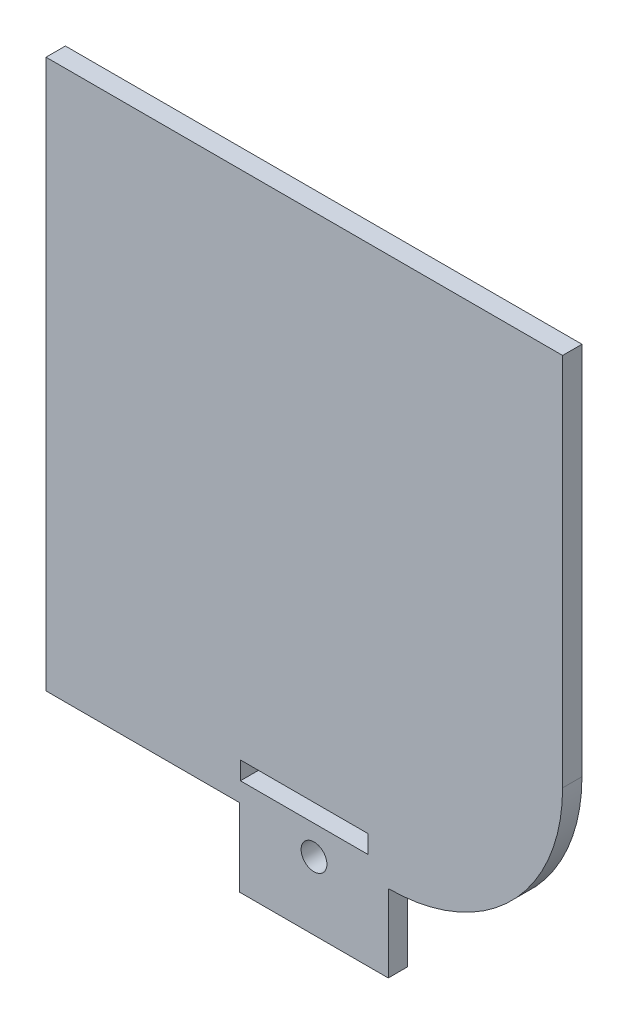
ISO-10303-21;
HEADER;
FILE_DESCRIPTION(('STEP AP214'),'2;1');
FILE_NAME('part.step','',(''),(''),'','','');
FILE_SCHEMA(('AUTOMOTIVE_DESIGN { 1 0 10303 214 1 1 1 1 }'));
ENDSEC;
DATA;
#1=APPLICATION_CONTEXT('core data for automotive mechanical design processes');
#2=APPLICATION_PROTOCOL_DEFINITION('international standard','automotive_design',2000,#1);
#3=PRODUCT_CONTEXT('',#1,'mechanical');
#4=PRODUCT('Part','Part','',(#3));
#5=PRODUCT_RELATED_PRODUCT_CATEGORY('part','',(#4));
#6=PRODUCT_DEFINITION_FORMATION('','',#4);
#7=PRODUCT_DEFINITION_CONTEXT('part definition',#1,'design');
#8=PRODUCT_DEFINITION('design','',#6,#7);
#9=PRODUCT_DEFINITION_SHAPE('','',#8);
#10=(LENGTH_UNIT() NAMED_UNIT(*) SI_UNIT(.MILLI.,.METRE.));
#11=(NAMED_UNIT(*) PLANE_ANGLE_UNIT() SI_UNIT($,.RADIAN.));
#12=(NAMED_UNIT(*) SI_UNIT($,.STERADIAN.) SOLID_ANGLE_UNIT());
#13=UNCERTAINTY_MEASURE_WITH_UNIT(LENGTH_MEASURE(1.E-05),#10,'distance_accuracy_value','');
#14=(GEOMETRIC_REPRESENTATION_CONTEXT(3) GLOBAL_UNCERTAINTY_ASSIGNED_CONTEXT((#13)) GLOBAL_UNIT_ASSIGNED_CONTEXT((#10,
#11,#12)) REPRESENTATION_CONTEXT('',''));
#15=CARTESIAN_POINT('',(0.,0.,0.));
#16=DIRECTION('',(0.,0.,1.));
#17=DIRECTION('',(1.,0.,0.));
#18=AXIS2_PLACEMENT_3D('',#15,#16,#17);
#19=CARTESIAN_POINT('',(13.,-29.,3.));
#20=DIRECTION('',(0.,0.,1.));
#21=DIRECTION('',(1.,0.,0.));
#22=AXIS2_PLACEMENT_3D('',#19,#20,#21);
#23=PLANE('',#22);
#24=DIRECTION('',(0.,-1.,0.));
#25=VECTOR('',#24,1.);
#26=CARTESIAN_POINT('',(-9.90000000000001,-50.2,3.));
#27=LINE('',#26,#25);
#28=CARTESIAN_POINT('',(-9.90000000000001,-50.2,3.));
#29=VERTEX_POINT('',#28);
#30=CARTESIAN_POINT('',(-9.89999999999998,-53.,3.));
#31=VERTEX_POINT('',#30);
#32=EDGE_CURVE('E142',#29,#31,#27,.T.);
#33=ORIENTED_EDGE('',*,*,#32,.F.);
#34=DIRECTION('',(-1.,0.,0.));
#35=VECTOR('',#34,1.);
#36=CARTESIAN_POINT('',(9.9,-50.2,3.));
#37=LINE('',#36,#35);
#38=CARTESIAN_POINT('',(9.9,-50.2,3.));
#39=VERTEX_POINT('',#38);
#40=EDGE_CURVE('E133',#39,#29,#37,.T.);
#41=ORIENTED_EDGE('',*,*,#40,.F.);
#42=DIRECTION('',(0.,1.,0.));
#43=VECTOR('',#42,1.);
#44=CARTESIAN_POINT('',(9.9,-53.,3.));
#45=LINE('',#44,#43);
#46=CARTESIAN_POINT('',(9.9,-53.,3.));
#47=VERTEX_POINT('',#46);
#48=EDGE_CURVE('E160',#47,#39,#45,.T.);
#49=ORIENTED_EDGE('',*,*,#48,.F.);
#50=DIRECTION('',(1.,0.,0.));
#51=VECTOR('',#50,1.);
#52=CARTESIAN_POINT('',(-9.89999999999998,-53.,3.));
#53=LINE('',#52,#51);
#54=EDGE_CURVE('E156',#31,#47,#53,.T.);
#55=ORIENTED_EDGE('',*,*,#54,.F.);
#56=EDGE_LOOP('',(#33,#41,#49,#55));
#57=FACE_BOUND('',#56,.T.);
#58=DIRECTION('',(0.,-1.,0.));
#59=VECTOR('',#58,1.);
#60=CARTESIAN_POINT('',(-40.,29.,3.));
#61=LINE('',#60,#59);
#62=CARTESIAN_POINT('',(-40.,29.,3.));
#63=VERTEX_POINT('',#62);
#64=CARTESIAN_POINT('',(-40.,-56.,3.));
#65=VERTEX_POINT('',#64);
#66=EDGE_CURVE('E184',#63,#65,#61,.T.);
#67=ORIENTED_EDGE('',*,*,#66,.T.);
#68=DIRECTION('',(1.,0.,0.));
#69=VECTOR('',#68,1.);
#70=CARTESIAN_POINT('',(-40.,-56.,3.));
#71=LINE('',#70,#69);
#72=CARTESIAN_POINT('',(-9.99999999999999,-56.,3.));
#73=VERTEX_POINT('',#72);
#74=EDGE_CURVE('E188',#65,#73,#71,.T.);
#75=ORIENTED_EDGE('',*,*,#74,.T.);
#76=DIRECTION('',(0.,-1.,0.));
#77=VECTOR('',#76,1.);
#78=CARTESIAN_POINT('',(-9.99999999999999,-56.,3.));
#79=LINE('',#78,#77);
#80=CARTESIAN_POINT('',(-9.99999999999999,-68.,3.));
#81=VERTEX_POINT('',#80);
#82=EDGE_CURVE('E192',#73,#81,#79,.T.);
#83=ORIENTED_EDGE('',*,*,#82,.T.);
#84=DIRECTION('',(1.,0.,0.));
#85=VECTOR('',#84,1.);
#86=CARTESIAN_POINT('',(-9.99999999999999,-68.,3.));
#87=LINE('',#86,#85);
#88=CARTESIAN_POINT('',(13.,-68.,3.));
#89=VERTEX_POINT('',#88);
#90=EDGE_CURVE('E195',#81,#89,#87,.T.);
#91=ORIENTED_EDGE('',*,*,#90,.T.);
#92=DIRECTION('',(0.,1.,0.));
#93=VECTOR('',#92,1.);
#94=CARTESIAN_POINT('',(13.,-68.,3.));
#95=LINE('',#94,#93);
#96=CARTESIAN_POINT('',(13.,-56.,3.));
#97=VERTEX_POINT('',#96);
#98=EDGE_CURVE('E198',#89,#97,#95,.T.);
#99=ORIENTED_EDGE('',*,*,#98,.T.);
#100=CARTESIAN_POINT('',(13.,-29.,3.));
#101=DIRECTION('',(0.,0.,1.));
#102=DIRECTION('',(1.,0.,0.));
#103=AXIS2_PLACEMENT_3D('',#100,#101,#102);
#104=CIRCLE('',#103,27.);
#105=CARTESIAN_POINT('',(40.,-29.,3.));
#106=VERTEX_POINT('',#105);
#107=EDGE_CURVE('E201',#97,#106,#104,.T.);
#108=ORIENTED_EDGE('',*,*,#107,.T.);
#109=DIRECTION('',(0.,1.,0.));
#110=VECTOR('',#109,1.);
#111=CARTESIAN_POINT('',(40.,29.,3.));
#112=LINE('',#111,#110);
#113=CARTESIAN_POINT('',(40.,29.,3.));
#114=VERTEX_POINT('',#113);
#115=EDGE_CURVE('E204',#106,#114,#112,.T.);
#116=ORIENTED_EDGE('',*,*,#115,.T.);
#117=DIRECTION('',(-1.,0.,0.));
#118=VECTOR('',#117,1.);
#119=CARTESIAN_POINT('',(-40.,29.,3.));
#120=LINE('',#119,#118);
#121=EDGE_CURVE('E207',#114,#63,#120,.T.);
#122=ORIENTED_EDGE('',*,*,#121,.T.);
#123=EDGE_LOOP('',(#67,#75,#83,#91,#99,#108,#116,#122));
#124=FACE_BOUND('',#123,.T.);
#125=CARTESIAN_POINT('',(1.49999999999999,-57.5,3.));
#126=DIRECTION('',(0.,0.,1.));
#127=DIRECTION('',(1.,0.,0.));
#128=AXIS2_PLACEMENT_3D('',#125,#126,#127);
#129=CIRCLE('',#128,2.);
#130=CARTESIAN_POINT('',(3.49999999999999,-57.5,3.));
#131=VERTEX_POINT('',#130);
#132=EDGE_CURVE('E168',#131,#131,#129,.T.);
#133=ORIENTED_EDGE('',*,*,#132,.F.);
#134=EDGE_LOOP('',(#133));
#135=FACE_BOUND('',#134,.T.);
#136=ADVANCED_FACE('F43',(#57,#124,#135),#23,.T.);
#137=CARTESIAN_POINT('',(13.,-29.,0.));
#138=DIRECTION('',(0.,0.,1.));
#139=DIRECTION('',(1.,0.,0.));
#140=AXIS2_PLACEMENT_3D('',#137,#138,#139);
#141=PLANE('',#140);
#142=DIRECTION('',(0.,-1.,0.));
#143=VECTOR('',#142,1.);
#144=CARTESIAN_POINT('',(-40.,29.,0.));
#145=LINE('',#144,#143);
#146=CARTESIAN_POINT('',(-40.,29.,0.));
#147=VERTEX_POINT('',#146);
#148=CARTESIAN_POINT('',(-40.,-56.,0.));
#149=VERTEX_POINT('',#148);
#150=EDGE_CURVE('E151',#147,#149,#145,.T.);
#151=ORIENTED_EDGE('',*,*,#150,.F.);
#152=DIRECTION('',(-1.,0.,0.));
#153=VECTOR('',#152,1.);
#154=CARTESIAN_POINT('',(-40.,29.,0.));
#155=LINE('',#154,#153);
#156=CARTESIAN_POINT('',(40.,29.,0.));
#157=VERTEX_POINT('',#156);
#158=EDGE_CURVE('E189',#157,#147,#155,.T.);
#159=ORIENTED_EDGE('',*,*,#158,.F.);
#160=DIRECTION('',(0.,1.,0.));
#161=VECTOR('',#160,1.);
#162=CARTESIAN_POINT('',(40.,29.,0.));
#163=LINE('',#162,#161);
#164=CARTESIAN_POINT('',(40.,-29.,0.));
#165=VERTEX_POINT('',#164);
#166=EDGE_CURVE('E229',#165,#157,#163,.T.);
#167=ORIENTED_EDGE('',*,*,#166,.F.);
#168=CARTESIAN_POINT('',(13.,-29.,0.));
#169=DIRECTION('',(0.,0.,1.));
#170=DIRECTION('',(1.,0.,0.));
#171=AXIS2_PLACEMENT_3D('',#168,#169,#170);
#172=CIRCLE('',#171,27.);
#173=CARTESIAN_POINT('',(13.,-56.,0.));
#174=VERTEX_POINT('',#173);
#175=EDGE_CURVE('E226',#174,#165,#172,.T.);
#176=ORIENTED_EDGE('',*,*,#175,.F.);
#177=DIRECTION('',(0.,1.,0.));
#178=VECTOR('',#177,1.);
#179=CARTESIAN_POINT('',(13.,-68.,0.));
#180=LINE('',#179,#178);
#181=CARTESIAN_POINT('',(13.,-68.,0.));
#182=VERTEX_POINT('',#181);
#183=EDGE_CURVE('E223',#182,#174,#180,.T.);
#184=ORIENTED_EDGE('',*,*,#183,.F.);
#185=DIRECTION('',(1.,0.,0.));
#186=VECTOR('',#185,1.);
#187=CARTESIAN_POINT('',(-9.99999999999999,-68.,0.));
#188=LINE('',#187,#186);
#189=CARTESIAN_POINT('',(-9.99999999999999,-68.,0.));
#190=VERTEX_POINT('',#189);
#191=EDGE_CURVE('E220',#190,#182,#188,.T.);
#192=ORIENTED_EDGE('',*,*,#191,.F.);
#193=DIRECTION('',(0.,-1.,0.));
#194=VECTOR('',#193,1.);
#195=CARTESIAN_POINT('',(-9.99999999999999,-56.,0.));
#196=LINE('',#195,#194);
#197=CARTESIAN_POINT('',(-9.99999999999999,-56.,0.));
#198=VERTEX_POINT('',#197);
#199=EDGE_CURVE('E217',#198,#190,#196,.T.);
#200=ORIENTED_EDGE('',*,*,#199,.F.);
#201=DIRECTION('',(1.,0.,0.));
#202=VECTOR('',#201,1.);
#203=CARTESIAN_POINT('',(-40.,-56.,0.));
#204=LINE('',#203,#202);
#205=EDGE_CURVE('E214',#149,#198,#204,.T.);
#206=ORIENTED_EDGE('',*,*,#205,.F.);
#207=EDGE_LOOP('',(#151,#159,#167,#176,#184,#192,#200,#206));
#208=FACE_BOUND('',#207,.T.);
#209=DIRECTION('',(-1.,0.,0.));
#210=VECTOR('',#209,1.);
#211=CARTESIAN_POINT('',(9.9,-50.2,0.));
#212=LINE('',#211,#210);
#213=CARTESIAN_POINT('',(9.9,-50.2,0.));
#214=VERTEX_POINT('',#213);
#215=CARTESIAN_POINT('',(-9.90000000000001,-50.2,0.));
#216=VERTEX_POINT('',#215);
#217=EDGE_CURVE('E67',#214,#216,#212,.T.);
#218=ORIENTED_EDGE('',*,*,#217,.T.);
#219=DIRECTION('',(0.,-1.,0.));
#220=VECTOR('',#219,1.);
#221=CARTESIAN_POINT('',(-9.90000000000001,-50.2,0.));
#222=LINE('',#221,#220);
#223=CARTESIAN_POINT('',(-9.89999999999998,-53.,0.));
#224=VERTEX_POINT('',#223);
#225=EDGE_CURVE('E149',#216,#224,#222,.T.);
#226=ORIENTED_EDGE('',*,*,#225,.T.);
#227=DIRECTION('',(1.,0.,0.));
#228=VECTOR('',#227,1.);
#229=CARTESIAN_POINT('',(-9.89999999999998,-53.,0.));
#230=LINE('',#229,#228);
#231=CARTESIAN_POINT('',(9.9,-53.,0.));
#232=VERTEX_POINT('',#231);
#233=EDGE_CURVE('E171',#224,#232,#230,.T.);
#234=ORIENTED_EDGE('',*,*,#233,.T.);
#235=DIRECTION('',(0.,1.,0.));
#236=VECTOR('',#235,1.);
#237=CARTESIAN_POINT('',(9.9,-53.,0.));
#238=LINE('',#237,#236);
#239=EDGE_CURVE('E143',#232,#214,#238,.T.);
#240=ORIENTED_EDGE('',*,*,#239,.T.);
#241=EDGE_LOOP('',(#218,#226,#234,#240));
#242=FACE_BOUND('',#241,.T.);
#243=CARTESIAN_POINT('',(1.49999999999999,-57.5,0.));
#244=DIRECTION('',(0.,0.,1.));
#245=DIRECTION('',(1.,0.,0.));
#246=AXIS2_PLACEMENT_3D('',#243,#244,#245);
#247=CIRCLE('',#246,2.);
#248=CARTESIAN_POINT('',(3.49999999999999,-57.5,0.));
#249=VERTEX_POINT('',#248);
#250=EDGE_CURVE('E343',#249,#249,#247,.T.);
#251=ORIENTED_EDGE('',*,*,#250,.T.);
#252=EDGE_LOOP('',(#251));
#253=FACE_BOUND('',#252,.T.);
#254=ADVANCED_FACE('F268',(#208,#242,#253),#141,.F.);
#255=CARTESIAN_POINT('',(-40.,29.,3.));
#256=DIRECTION('',(1.,0.,0.));
#257=DIRECTION('',(0.,1.,0.));
#258=AXIS2_PLACEMENT_3D('',#255,#256,#257);
#259=PLANE('',#258);
#260=ORIENTED_EDGE('',*,*,#150,.T.);
#261=DIRECTION('',(0.,0.,-1.));
#262=VECTOR('',#261,1.);
#263=CARTESIAN_POINT('',(-40.,-56.,3.));
#264=LINE('',#263,#262);
#265=EDGE_CURVE('E11',#65,#149,#264,.T.);
#266=ORIENTED_EDGE('',*,*,#265,.F.);
#267=ORIENTED_EDGE('',*,*,#66,.F.);
#268=DIRECTION('',(0.,0.,-1.));
#269=VECTOR('',#268,1.);
#270=CARTESIAN_POINT('',(-40.,29.,3.));
#271=LINE('',#270,#269);
#272=EDGE_CURVE('E210',#63,#147,#271,.T.);
#273=ORIENTED_EDGE('',*,*,#272,.T.);
#274=EDGE_LOOP('',(#260,#266,#267,#273));
#275=FACE_BOUND('',#274,.T.);
#276=ADVANCED_FACE('F45',(#275),#259,.F.);
#277=CARTESIAN_POINT('',(-40.,-56.,3.));
#278=DIRECTION('',(0.,1.,0.));
#279=DIRECTION('',(0.,0.,1.));
#280=AXIS2_PLACEMENT_3D('',#277,#278,#279);
#281=PLANE('',#280);
#282=ORIENTED_EDGE('',*,*,#205,.T.);
#283=DIRECTION('',(0.,0.,-1.));
#284=VECTOR('',#283,1.);
#285=CARTESIAN_POINT('',(-9.99999999999999,-56.,3.));
#286=LINE('',#285,#284);
#287=EDGE_CURVE('E52',#73,#198,#286,.T.);
#288=ORIENTED_EDGE('',*,*,#287,.F.);
#289=ORIENTED_EDGE('',*,*,#74,.F.);
#290=ORIENTED_EDGE('',*,*,#265,.T.);
#291=EDGE_LOOP('',(#282,#288,#289,#290));
#292=FACE_BOUND('',#291,.T.);
#293=ADVANCED_FACE('F285',(#292),#281,.F.);
#294=CARTESIAN_POINT('',(-9.99999999999999,-56.,3.));
#295=DIRECTION('',(1.,0.,0.));
#296=DIRECTION('',(0.,1.,0.));
#297=AXIS2_PLACEMENT_3D('',#294,#295,#296);
#298=PLANE('',#297);
#299=ORIENTED_EDGE('',*,*,#199,.T.);
#300=DIRECTION('',(0.,0.,-1.));
#301=VECTOR('',#300,1.);
#302=CARTESIAN_POINT('',(-9.99999999999999,-68.,3.));
#303=LINE('',#302,#301);
#304=EDGE_CURVE('E253',#81,#190,#303,.T.);
#305=ORIENTED_EDGE('',*,*,#304,.F.);
#306=ORIENTED_EDGE('',*,*,#82,.F.);
#307=ORIENTED_EDGE('',*,*,#287,.T.);
#308=EDGE_LOOP('',(#299,#305,#306,#307));
#309=FACE_BOUND('',#308,.T.);
#310=ADVANCED_FACE('F262',(#309),#298,.F.);
#311=CARTESIAN_POINT('',(-9.99999999999999,-68.,3.));
#312=DIRECTION('',(0.,1.,0.));
#313=DIRECTION('',(-1.,0.,0.));
#314=AXIS2_PLACEMENT_3D('',#311,#312,#313);
#315=PLANE('',#314);
#316=ORIENTED_EDGE('',*,*,#191,.T.);
#317=DIRECTION('',(0.,0.,-1.));
#318=VECTOR('',#317,1.);
#319=CARTESIAN_POINT('',(13.,-68.,3.));
#320=LINE('',#319,#318);
#321=EDGE_CURVE('E249',#89,#182,#320,.T.);
#322=ORIENTED_EDGE('',*,*,#321,.F.);
#323=ORIENTED_EDGE('',*,*,#90,.F.);
#324=ORIENTED_EDGE('',*,*,#304,.T.);
#325=EDGE_LOOP('',(#316,#322,#323,#324));
#326=FACE_BOUND('',#325,.T.);
#327=ADVANCED_FACE('F274',(#326),#315,.F.);
#328=CARTESIAN_POINT('',(13.,-68.,3.));
#329=DIRECTION('',(-1.,0.,0.));
#330=DIRECTION('',(0.,-1.,0.));
#331=AXIS2_PLACEMENT_3D('',#328,#329,#330);
#332=PLANE('',#331);
#333=ORIENTED_EDGE('',*,*,#183,.T.);
#334=DIRECTION('',(0.,0.,-1.));
#335=VECTOR('',#334,1.);
#336=CARTESIAN_POINT('',(13.,-56.,3.));
#337=LINE('',#336,#335);
#338=EDGE_CURVE('E245',#97,#174,#337,.T.);
#339=ORIENTED_EDGE('',*,*,#338,.F.);
#340=ORIENTED_EDGE('',*,*,#98,.F.);
#341=ORIENTED_EDGE('',*,*,#321,.T.);
#342=EDGE_LOOP('',(#333,#339,#340,#341));
#343=FACE_BOUND('',#342,.T.);
#344=ADVANCED_FACE('F278',(#343),#332,.F.);
#345=CARTESIAN_POINT('',(13.,-29.,3.));
#346=DIRECTION('',(0.,0.,-1.));
#347=DIRECTION('',(-1.,0.,0.));
#348=AXIS2_PLACEMENT_3D('',#345,#346,#347);
#349=CYLINDRICAL_SURFACE('',#348,27.);
#350=ORIENTED_EDGE('',*,*,#175,.T.);
#351=DIRECTION('',(0.,0.,-1.));
#352=VECTOR('',#351,1.);
#353=CARTESIAN_POINT('',(40.,-29.,3.));
#354=LINE('',#353,#352);
#355=EDGE_CURVE('E241',#106,#165,#354,.T.);
#356=ORIENTED_EDGE('',*,*,#355,.F.);
#357=ORIENTED_EDGE('',*,*,#107,.F.);
#358=ORIENTED_EDGE('',*,*,#338,.T.);
#359=EDGE_LOOP('',(#350,#356,#357,#358));
#360=FACE_BOUND('',#359,.T.);
#361=ADVANCED_FACE('F298',(#360),#349,.T.);
#362=CARTESIAN_POINT('',(40.,29.,3.));
#363=DIRECTION('',(-1.,0.,0.));
#364=DIRECTION('',(0.,-1.,0.));
#365=AXIS2_PLACEMENT_3D('',#362,#363,#364);
#366=PLANE('',#365);
#367=ORIENTED_EDGE('',*,*,#166,.T.);
#368=DIRECTION('',(0.,0.,-1.));
#369=VECTOR('',#368,1.);
#370=CARTESIAN_POINT('',(40.,29.,3.));
#371=LINE('',#370,#369);
#372=EDGE_CURVE('E237',#114,#157,#371,.T.);
#373=ORIENTED_EDGE('',*,*,#372,.F.);
#374=ORIENTED_EDGE('',*,*,#115,.F.);
#375=ORIENTED_EDGE('',*,*,#355,.T.);
#376=EDGE_LOOP('',(#367,#373,#374,#375));
#377=FACE_BOUND('',#376,.T.);
#378=ADVANCED_FACE('F296',(#377),#366,.F.);
#379=CARTESIAN_POINT('',(-40.,29.,3.));
#380=DIRECTION('',(0.,-1.,0.));
#381=DIRECTION('',(1.,0.,0.));
#382=AXIS2_PLACEMENT_3D('',#379,#380,#381);
#383=PLANE('',#382);
#384=ORIENTED_EDGE('',*,*,#158,.T.);
#385=ORIENTED_EDGE('',*,*,#272,.F.);
#386=ORIENTED_EDGE('',*,*,#121,.F.);
#387=ORIENTED_EDGE('',*,*,#372,.T.);
#388=EDGE_LOOP('',(#384,#385,#386,#387));
#389=FACE_BOUND('',#388,.T.);
#390=ADVANCED_FACE('F291',(#389),#383,.F.);
#391=CARTESIAN_POINT('',(9.9,-50.2,3.));
#392=DIRECTION('',(0.,-1.,0.));
#393=DIRECTION('',(0.,0.,-1.));
#394=AXIS2_PLACEMENT_3D('',#391,#392,#393);
#395=PLANE('',#394);
#396=ORIENTED_EDGE('',*,*,#217,.F.);
#397=DIRECTION('',(0.,0.,-1.));
#398=VECTOR('',#397,1.);
#399=CARTESIAN_POINT('',(9.9,-50.2,3.));
#400=LINE('',#399,#398);
#401=EDGE_CURVE('E137',#39,#214,#400,.T.);
#402=ORIENTED_EDGE('',*,*,#401,.F.);
#403=ORIENTED_EDGE('',*,*,#40,.T.);
#404=DIRECTION('',(0.,0.,-1.));
#405=VECTOR('',#404,1.);
#406=CARTESIAN_POINT('',(-9.90000000000001,-50.2,3.));
#407=LINE('',#406,#405);
#408=EDGE_CURVE('E136',#29,#216,#407,.T.);
#409=ORIENTED_EDGE('',*,*,#408,.T.);
#410=EDGE_LOOP('',(#396,#402,#403,#409));
#411=FACE_BOUND('',#410,.T.);
#412=ADVANCED_FACE('F135',(#411),#395,.T.);
#413=CARTESIAN_POINT('',(-9.90000000000001,-50.2,3.));
#414=DIRECTION('',(1.,0.,0.));
#415=DIRECTION('',(0.,1.,0.));
#416=AXIS2_PLACEMENT_3D('',#413,#414,#415);
#417=PLANE('',#416);
#418=ORIENTED_EDGE('',*,*,#225,.F.);
#419=ORIENTED_EDGE('',*,*,#408,.F.);
#420=ORIENTED_EDGE('',*,*,#32,.T.);
#421=DIRECTION('',(0.,0.,-1.));
#422=VECTOR('',#421,1.);
#423=CARTESIAN_POINT('',(-9.89999999999998,-53.,3.));
#424=LINE('',#423,#422);
#425=EDGE_CURVE('E152',#31,#224,#424,.T.);
#426=ORIENTED_EDGE('',*,*,#425,.T.);
#427=EDGE_LOOP('',(#418,#419,#420,#426));
#428=FACE_BOUND('',#427,.T.);
#429=ADVANCED_FACE('F146',(#428),#417,.T.);
#430=CARTESIAN_POINT('',(-9.89999999999998,-53.,3.));
#431=DIRECTION('',(0.,1.,0.));
#432=DIRECTION('',(-1.,0.,0.));
#433=AXIS2_PLACEMENT_3D('',#430,#431,#432);
#434=PLANE('',#433);
#435=ORIENTED_EDGE('',*,*,#233,.F.);
#436=ORIENTED_EDGE('',*,*,#425,.F.);
#437=ORIENTED_EDGE('',*,*,#54,.T.);
#438=DIRECTION('',(0.,0.,-1.));
#439=VECTOR('',#438,1.);
#440=CARTESIAN_POINT('',(9.9,-53.,3.));
#441=LINE('',#440,#439);
#442=EDGE_CURVE('E59',#47,#232,#441,.T.);
#443=ORIENTED_EDGE('',*,*,#442,.T.);
#444=EDGE_LOOP('',(#435,#436,#437,#443));
#445=FACE_BOUND('',#444,.T.);
#446=ADVANCED_FACE('F323',(#445),#434,.T.);
#447=CARTESIAN_POINT('',(9.9,-53.,3.));
#448=DIRECTION('',(-1.,0.,0.));
#449=DIRECTION('',(0.,-1.,0.));
#450=AXIS2_PLACEMENT_3D('',#447,#448,#449);
#451=PLANE('',#450);
#452=ORIENTED_EDGE('',*,*,#239,.F.);
#453=ORIENTED_EDGE('',*,*,#442,.F.);
#454=ORIENTED_EDGE('',*,*,#48,.T.);
#455=ORIENTED_EDGE('',*,*,#401,.T.);
#456=EDGE_LOOP('',(#452,#453,#454,#455));
#457=FACE_BOUND('',#456,.T.);
#458=ADVANCED_FACE('F327',(#457),#451,.T.);
#459=CARTESIAN_POINT('',(1.49999999999999,-57.5,3.));
#460=DIRECTION('',(0.,0.,-1.));
#461=DIRECTION('',(-1.,0.,0.));
#462=AXIS2_PLACEMENT_3D('',#459,#460,#461);
#463=CYLINDRICAL_SURFACE('',#462,2.);
#464=ORIENTED_EDGE('',*,*,#132,.T.);
#465=EDGE_LOOP('',(#464));
#466=FACE_BOUND('',#465,.T.);
#467=ORIENTED_EDGE('',*,*,#250,.F.);
#468=EDGE_LOOP('',(#467));
#469=FACE_BOUND('',#468,.T.);
#470=ADVANCED_FACE('F333',(#466,#469),#463,.F.);
#471=CLOSED_SHELL('',(#136,#254,#276,#293,#310,#327,#344,#361,#378,#390,#412,#429,#446,#458,#470));
#472=MANIFOLD_SOLID_BREP('B2',#471);
#473=ADVANCED_BREP_SHAPE_REPRESENTATION('',(#18,#472),#14);
#474=SHAPE_DEFINITION_REPRESENTATION(#9,#473);
ENDSEC;
END-ISO-10303-21;
